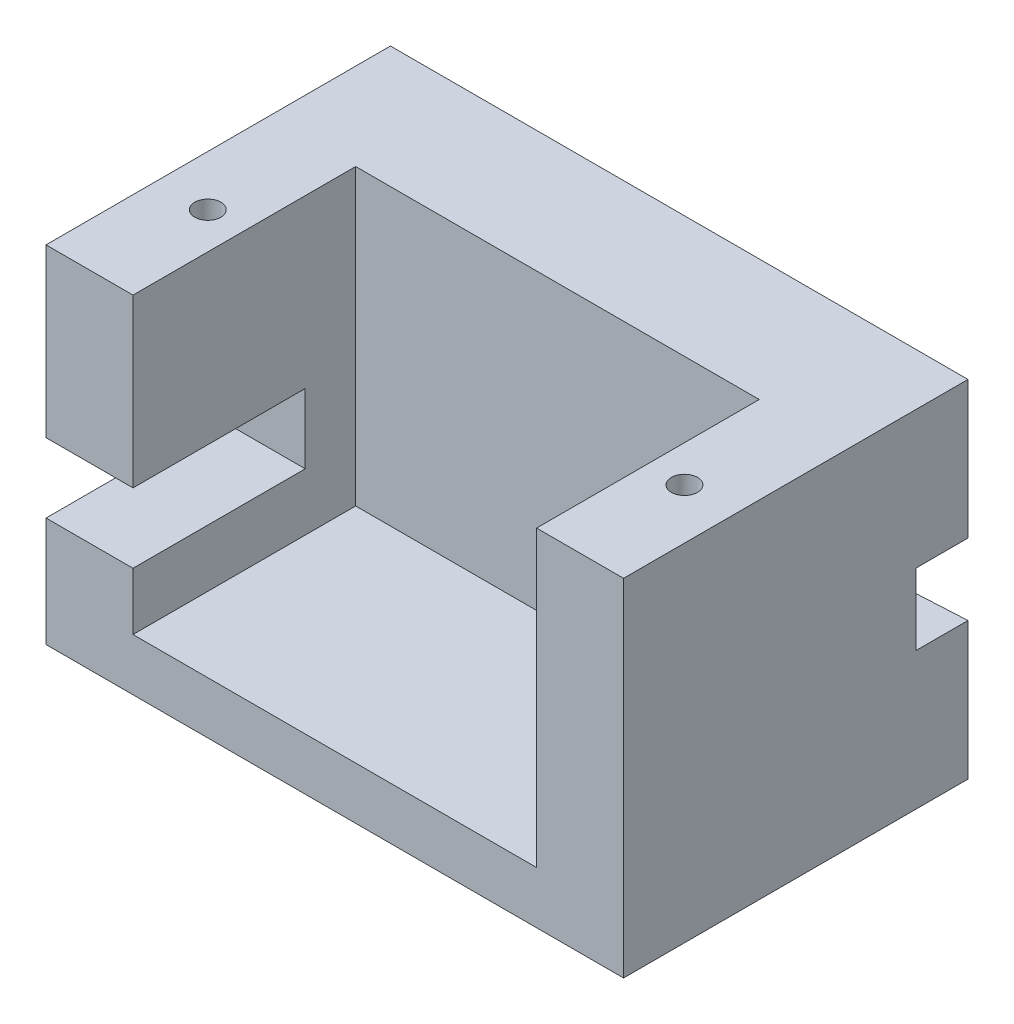
ISO-10303-21;
HEADER;
FILE_DESCRIPTION(('STEP AP214'),'2;1');
FILE_NAME('part.step','',(''),(''),'','','');
FILE_SCHEMA(('AUTOMOTIVE_DESIGN { 1 0 10303 214 1 1 1 1 }'));
ENDSEC;
DATA;
#1=APPLICATION_CONTEXT('core data for automotive mechanical design processes');
#2=APPLICATION_PROTOCOL_DEFINITION('international standard','automotive_design',2000,#1);
#3=PRODUCT_CONTEXT('',#1,'mechanical');
#4=PRODUCT('Part','Part','',(#3));
#5=PRODUCT_RELATED_PRODUCT_CATEGORY('part','',(#4));
#6=PRODUCT_DEFINITION_FORMATION('','',#4);
#7=PRODUCT_DEFINITION_CONTEXT('part definition',#1,'design');
#8=PRODUCT_DEFINITION('design','',#6,#7);
#9=PRODUCT_DEFINITION_SHAPE('','',#8);
#10=(LENGTH_UNIT() NAMED_UNIT(*) SI_UNIT(.MILLI.,.METRE.));
#11=(NAMED_UNIT(*) PLANE_ANGLE_UNIT() SI_UNIT($,.RADIAN.));
#12=(NAMED_UNIT(*) SI_UNIT($,.STERADIAN.) SOLID_ANGLE_UNIT());
#13=UNCERTAINTY_MEASURE_WITH_UNIT(LENGTH_MEASURE(1.E-05),#10,'distance_accuracy_value','');
#14=(GEOMETRIC_REPRESENTATION_CONTEXT(3) GLOBAL_UNCERTAINTY_ASSIGNED_CONTEXT((#13)) GLOBAL_UNIT_ASSIGNED_CONTEXT((#10,
#11,#12)) REPRESENTATION_CONTEXT('',''));
#15=CARTESIAN_POINT('',(0.,0.,0.));
#16=DIRECTION('',(0.,0.,1.));
#17=DIRECTION('',(1.,0.,0.));
#18=AXIS2_PLACEMENT_3D('',#15,#16,#17);
#19=CARTESIAN_POINT('',(27.9,16.6,0.3));
#20=DIRECTION('',(0.,0.,-1.));
#21=DIRECTION('',(0.,1.,0.));
#22=AXIS2_PLACEMENT_3D('',#19,#20,#21);
#23=PLANE('',#22);
#24=DIRECTION('',(0.,-1.,0.));
#25=VECTOR('',#24,1.);
#26=CARTESIAN_POINT('',(-0.3,57.175054314054,0.3));
#27=LINE('',#26,#25);
#28=CARTESIAN_POINT('',(-0.300000000000002,3.,0.3));
#29=VERTEX_POINT('',#28);
#30=CARTESIAN_POINT('',(-0.3,-0.3,0.300000000000004));
#31=VERTEX_POINT('',#30);
#32=EDGE_CURVE('E184',#29,#31,#27,.T.);
#33=ORIENTED_EDGE('',*,*,#32,.F.);
#34=DIRECTION('',(-1.,0.,0.));
#35=VECTOR('',#34,1.);
#36=CARTESIAN_POINT('',(27.901,3.,0.299999999999999));
#37=LINE('',#36,#35);
#38=CARTESIAN_POINT('',(-5.3,3.,0.300000000000004));
#39=VERTEX_POINT('',#38);
#40=EDGE_CURVE('E192',#29,#39,#37,.T.);
#41=ORIENTED_EDGE('',*,*,#40,.T.);
#42=DIRECTION('',(0.,-1.,0.));
#43=VECTOR('',#42,1.);
#44=CARTESIAN_POINT('',(-5.3,16.6,0.300000000000001));
#45=LINE('',#44,#43);
#46=CARTESIAN_POINT('',(-5.3,-3.3,0.300000000000001));
#47=VERTEX_POINT('',#46);
#48=EDGE_CURVE('E424',#39,#47,#45,.T.);
#49=ORIENTED_EDGE('',*,*,#48,.T.);
#50=DIRECTION('',(-1.,0.,0.));
#51=VECTOR('',#50,1.);
#52=CARTESIAN_POINT('',(27.9,-3.3,0.300000000000005));
#53=LINE('',#52,#51);
#54=CARTESIAN_POINT('',(27.9,-3.3,0.300000000000005));
#55=VERTEX_POINT('',#54);
#56=EDGE_CURVE('E313',#55,#47,#53,.T.);
#57=ORIENTED_EDGE('',*,*,#56,.F.);
#58=DIRECTION('',(0.,-1.,0.));
#59=VECTOR('',#58,1.);
#60=CARTESIAN_POINT('',(27.9,16.6,0.3));
#61=LINE('',#60,#59);
#62=CARTESIAN_POINT('',(27.9,16.6,0.3));
#63=VERTEX_POINT('',#62);
#64=EDGE_CURVE('E419',#63,#55,#61,.T.);
#65=ORIENTED_EDGE('',*,*,#64,.F.);
#66=DIRECTION('',(-1.,0.,0.));
#67=VECTOR('',#66,1.);
#68=CARTESIAN_POINT('',(27.9,16.6,0.3));
#69=LINE('',#68,#67);
#70=CARTESIAN_POINT('',(22.9,16.6,0.3));
#71=VERTEX_POINT('',#70);
#72=EDGE_CURVE('E413',#63,#71,#69,.T.);
#73=ORIENTED_EDGE('',*,*,#72,.T.);
#74=DIRECTION('',(0.,-1.,0.));
#75=VECTOR('',#74,1.);
#76=CARTESIAN_POINT('',(22.9,57.175054314054,0.3));
#77=LINE('',#76,#75);
#78=CARTESIAN_POINT('',(22.9,-0.3,0.300000000000004));
#79=VERTEX_POINT('',#78);
#80=EDGE_CURVE('E215',#71,#79,#77,.T.);
#81=ORIENTED_EDGE('',*,*,#80,.T.);
#82=DIRECTION('',(-1.,0.,0.));
#83=VECTOR('',#82,1.);
#84=CARTESIAN_POINT('',(22.9,-0.3,0.3));
#85=LINE('',#84,#83);
#86=EDGE_CURVE('E200',#79,#31,#85,.T.);
#87=ORIENTED_EDGE('',*,*,#86,.T.);
#88=EDGE_LOOP('',(#33,#41,#49,#57,#65,#73,#81,#87));
#89=FACE_BOUND('',#88,.T.);
#90=ADVANCED_FACE('F39',(#89),#23,.F.);
#91=CARTESIAN_POINT('',(0.,0.,-19.5));
#92=DIRECTION('',(0.,0.,-1.));
#93=DIRECTION('',(-1.,0.,0.));
#94=AXIS2_PLACEMENT_3D('',#91,#92,#93);
#95=PLANE('',#94);
#96=DIRECTION('',(-0.998711997828753,0.0507380073800736,0.));
#97=VECTOR('',#96,1.);
#98=CARTESIAN_POINT('',(-1.89708740221759,4.425,-19.5));
#99=LINE('',#98,#97);
#100=CARTESIAN_POINT('',(8.9289506542461,3.875,-19.5));
#101=VERTEX_POINT('',#100);
#102=CARTESIAN_POINT('',(-5.29999999999999,4.59787967389537,-19.5));
#103=VERTEX_POINT('',#102);
#104=EDGE_CURVE('E354',#101,#103,#99,.T.);
#105=ORIENTED_EDGE('',*,*,#104,.F.);
#106=CARTESIAN_POINT('',(11.3,6.65,-19.5));
#107=DIRECTION('',(0.,0.,-1.));
#108=DIRECTION('',(-1.,0.,0.));
#109=AXIS2_PLACEMENT_3D('',#106,#107,#108);
#110=CIRCLE('',#109,3.65);
#111=CARTESIAN_POINT('',(13.6710493457539,3.875,-19.5));
#112=VERTEX_POINT('',#111);
#113=EDGE_CURVE('E357',#112,#101,#110,.T.);
#114=ORIENTED_EDGE('',*,*,#113,.F.);
#115=DIRECTION('',(-0.998711997828753,-0.050738007380074,0.));
#116=VECTOR('',#115,1.);
#117=CARTESIAN_POINT('',(13.6710493457539,3.875,-19.5));
#118=LINE('',#117,#116);
#119=CARTESIAN_POINT('',(27.9,4.59787967389538,-19.5));
#120=VERTEX_POINT('',#119);
#121=EDGE_CURVE('E361',#120,#112,#118,.T.);
#122=ORIENTED_EDGE('',*,*,#121,.F.);
#123=DIRECTION('',(0.,-1.,0.));
#124=VECTOR('',#123,1.);
#125=CARTESIAN_POINT('',(27.9,16.6,-19.5));
#126=LINE('',#125,#124);
#127=CARTESIAN_POINT('',(27.9,-3.3,-19.5));
#128=VERTEX_POINT('',#127);
#129=EDGE_CURVE('E273',#120,#128,#126,.T.);
#130=ORIENTED_EDGE('',*,*,#129,.T.);
#131=DIRECTION('',(-1.,0.,0.));
#132=VECTOR('',#131,1.);
#133=CARTESIAN_POINT('',(27.9,-3.3,-19.5));
#134=LINE('',#133,#132);
#135=CARTESIAN_POINT('',(-5.3,-3.3,-19.5));
#136=VERTEX_POINT('',#135);
#137=EDGE_CURVE('E268',#128,#136,#134,.T.);
#138=ORIENTED_EDGE('',*,*,#137,.T.);
#139=DIRECTION('',(0.,1.,0.));
#140=VECTOR('',#139,1.);
#141=CARTESIAN_POINT('',(-5.3,-3.3,-19.5));
#142=LINE('',#141,#140);
#143=EDGE_CURVE('E267',#136,#103,#142,.T.);
#144=ORIENTED_EDGE('',*,*,#143,.T.);
#145=EDGE_LOOP('',(#105,#114,#122,#130,#138,#144));
#146=FACE_BOUND('',#145,.T.);
#147=ADVANCED_FACE('F320',(#146),#95,.T.);
#148=CARTESIAN_POINT('',(27.9,57.175054314054,-17.5));
#149=DIRECTION('',(1.,0.,0.));
#150=DIRECTION('',(0.,0.,-1.));
#151=AXIS2_PLACEMENT_3D('',#148,#149,#150);
#152=PLANE('',#151);
#153=ORIENTED_EDGE('',*,*,#64,.T.);
#154=DIRECTION('',(0.,0.,1.));
#155=VECTOR('',#154,1.);
#156=CARTESIAN_POINT('',(27.9,-3.3,-17.5));
#157=LINE('',#156,#155);
#158=EDGE_CURVE('E301',#128,#55,#157,.T.);
#159=ORIENTED_EDGE('',*,*,#158,.F.);
#160=ORIENTED_EDGE('',*,*,#129,.F.);
#161=DIRECTION('',(0.,0.,-1.));
#162=VECTOR('',#161,1.);
#163=CARTESIAN_POINT('',(27.9,4.59787967389538,-16.5));
#164=LINE('',#163,#162);
#165=CARTESIAN_POINT('',(27.9,4.59787967389538,-16.5));
#166=VERTEX_POINT('',#165);
#167=EDGE_CURVE('E338',#166,#120,#164,.T.);
#168=ORIENTED_EDGE('',*,*,#167,.F.);
#169=DIRECTION('',(0.,-1.,0.));
#170=VECTOR('',#169,1.);
#171=CARTESIAN_POINT('',(27.9,8.70212032610463,-16.5));
#172=LINE('',#171,#170);
#173=CARTESIAN_POINT('',(27.9,8.70212032610463,-16.5));
#174=VERTEX_POINT('',#173);
#175=EDGE_CURVE('E388',#174,#166,#172,.T.);
#176=ORIENTED_EDGE('',*,*,#175,.F.);
#177=DIRECTION('',(0.,0.,-1.));
#178=VECTOR('',#177,1.);
#179=CARTESIAN_POINT('',(27.9,8.70212032610463,-16.5));
#180=LINE('',#179,#178);
#181=CARTESIAN_POINT('',(27.9,8.70212032610463,-19.5));
#182=VERTEX_POINT('',#181);
#183=EDGE_CURVE('E333',#174,#182,#180,.T.);
#184=ORIENTED_EDGE('',*,*,#183,.T.);
#185=CARTESIAN_POINT('',(27.9,16.6,-19.5));
#186=VERTEX_POINT('',#185);
#187=EDGE_CURVE('E190',#186,#182,#126,.T.);
#188=ORIENTED_EDGE('',*,*,#187,.F.);
#189=DIRECTION('',(0.,0.,1.));
#190=VECTOR('',#189,1.);
#191=CARTESIAN_POINT('',(27.9,16.6,-17.5));
#192=LINE('',#191,#190);
#193=EDGE_CURVE('E239',#186,#63,#192,.T.);
#194=ORIENTED_EDGE('',*,*,#193,.T.);
#195=EDGE_LOOP('',(#153,#159,#160,#168,#176,#184,#188,#194));
#196=FACE_BOUND('',#195,.T.);
#197=ADVANCED_FACE('F446',(#196),#152,.T.);
#198=CARTESIAN_POINT('',(-5.3,57.175054314054,-17.5));
#199=DIRECTION('',(-1.,0.,0.));
#200=DIRECTION('',(0.,0.,1.));
#201=AXIS2_PLACEMENT_3D('',#198,#199,#200);
#202=PLANE('',#201);
#203=ORIENTED_EDGE('',*,*,#48,.F.);
#204=DIRECTION('',(0.,0.,1.));
#205=VECTOR('',#204,1.);
#206=CARTESIAN_POINT('',(-5.3,3.,-9.6));
#207=LINE('',#206,#205);
#208=CARTESIAN_POINT('',(-5.3,3.,-9.6));
#209=VERTEX_POINT('',#208);
#210=EDGE_CURVE('E57',#209,#39,#207,.T.);
#211=ORIENTED_EDGE('',*,*,#210,.F.);
#212=DIRECTION('',(0.,-1.,0.));
#213=VECTOR('',#212,1.);
#214=CARTESIAN_POINT('',(-5.3,7.,-9.6));
#215=LINE('',#214,#213);
#216=CARTESIAN_POINT('',(-5.3,7.,-9.6));
#217=VERTEX_POINT('',#216);
#218=EDGE_CURVE('E289',#217,#209,#215,.T.);
#219=ORIENTED_EDGE('',*,*,#218,.F.);
#220=DIRECTION('',(0.,0.,1.));
#221=VECTOR('',#220,1.);
#222=CARTESIAN_POINT('',(-5.3,7.,-9.6));
#223=LINE('',#222,#221);
#224=CARTESIAN_POINT('',(-5.3,7.,0.300000000000001));
#225=VERTEX_POINT('',#224);
#226=EDGE_CURVE('E282',#217,#225,#223,.T.);
#227=ORIENTED_EDGE('',*,*,#226,.T.);
#228=CARTESIAN_POINT('',(-5.3,16.6,0.300000000000001));
#229=VERTEX_POINT('',#228);
#230=EDGE_CURVE('E252',#229,#225,#45,.T.);
#231=ORIENTED_EDGE('',*,*,#230,.F.);
#232=DIRECTION('',(0.,0.,-1.));
#233=VECTOR('',#232,1.);
#234=CARTESIAN_POINT('',(-5.3,16.6,-17.5));
#235=LINE('',#234,#233);
#236=CARTESIAN_POINT('',(-5.3,16.6,-19.5));
#237=VERTEX_POINT('',#236);
#238=EDGE_CURVE('E217',#229,#237,#235,.T.);
#239=ORIENTED_EDGE('',*,*,#238,.T.);
#240=CARTESIAN_POINT('',(-5.29999999999999,8.70212032610463,-19.5));
#241=VERTEX_POINT('',#240);
#242=EDGE_CURVE('E250',#241,#237,#142,.T.);
#243=ORIENTED_EDGE('',*,*,#242,.F.);
#244=DIRECTION('',(0.,0.,-1.));
#245=VECTOR('',#244,1.);
#246=CARTESIAN_POINT('',(-5.29999999999999,8.70212032610463,-16.5));
#247=LINE('',#246,#245);
#248=CARTESIAN_POINT('',(-5.29999999999999,8.70212032610463,-16.5));
#249=VERTEX_POINT('',#248);
#250=EDGE_CURVE('E326',#249,#241,#247,.T.);
#251=ORIENTED_EDGE('',*,*,#250,.F.);
#252=DIRECTION('',(0.,1.,0.));
#253=VECTOR('',#252,1.);
#254=CARTESIAN_POINT('',(-5.29999999999999,8.70212032610463,-16.5));
#255=LINE('',#254,#253);
#256=CARTESIAN_POINT('',(-5.29999999999999,4.59787967389537,-16.5));
#257=VERTEX_POINT('',#256);
#258=EDGE_CURVE('E374',#257,#249,#255,.T.);
#259=ORIENTED_EDGE('',*,*,#258,.F.);
#260=DIRECTION('',(0.,0.,-1.));
#261=VECTOR('',#260,1.);
#262=CARTESIAN_POINT('',(-5.29999999999999,4.59787967389537,-16.5));
#263=LINE('',#262,#261);
#264=EDGE_CURVE('E317',#257,#103,#263,.T.);
#265=ORIENTED_EDGE('',*,*,#264,.T.);
#266=ORIENTED_EDGE('',*,*,#143,.F.);
#267=DIRECTION('',(0.,0.,-1.));
#268=VECTOR('',#267,1.);
#269=CARTESIAN_POINT('',(-5.3,-3.3,5.3));
#270=LINE('',#269,#268);
#271=EDGE_CURVE('E230',#47,#136,#270,.T.);
#272=ORIENTED_EDGE('',*,*,#271,.F.);
#273=EDGE_LOOP('',(#203,#211,#219,#227,#231,#239,#243,#251,#259,#265,#266,#272));
#274=FACE_BOUND('',#273,.T.);
#275=ADVANCED_FACE('F248',(#274),#202,.T.);
#276=CARTESIAN_POINT('',(22.9,57.175054314054,-12.5));
#277=DIRECTION('',(1.,0.,0.));
#278=DIRECTION('',(0.,0.,-1.));
#279=AXIS2_PLACEMENT_3D('',#276,#277,#278);
#280=PLANE('',#279);
#281=DIRECTION('',(0.,0.,1.));
#282=VECTOR('',#281,1.);
#283=CARTESIAN_POINT('',(22.9,16.6,-12.5));
#284=LINE('',#283,#282);
#285=CARTESIAN_POINT('',(22.9,16.6,-12.5));
#286=VERTEX_POINT('',#285);
#287=EDGE_CURVE('E235',#286,#71,#284,.T.);
#288=ORIENTED_EDGE('',*,*,#287,.F.);
#289=DIRECTION('',(0.,-1.,0.));
#290=VECTOR('',#289,1.);
#291=CARTESIAN_POINT('',(22.9,57.175054314054,-12.5));
#292=LINE('',#291,#290);
#293=CARTESIAN_POINT('',(22.9,-0.3,-12.5));
#294=VERTEX_POINT('',#293);
#295=EDGE_CURVE('E218',#286,#294,#292,.T.);
#296=ORIENTED_EDGE('',*,*,#295,.T.);
#297=DIRECTION('',(0.,0.,1.));
#298=VECTOR('',#297,1.);
#299=CARTESIAN_POINT('',(22.9,-0.3,-12.5));
#300=LINE('',#299,#298);
#301=EDGE_CURVE('E221',#294,#79,#300,.T.);
#302=ORIENTED_EDGE('',*,*,#301,.T.);
#303=ORIENTED_EDGE('',*,*,#80,.F.);
#304=EDGE_LOOP('',(#288,#296,#302,#303));
#305=FACE_BOUND('',#304,.T.);
#306=ADVANCED_FACE('F467',(#305),#280,.F.);
#307=CARTESIAN_POINT('',(22.9,57.175054314054,-12.5));
#308=DIRECTION('',(0.,0.,-1.));
#309=DIRECTION('',(-1.,0.,0.));
#310=AXIS2_PLACEMENT_3D('',#307,#308,#309);
#311=PLANE('',#310);
#312=DIRECTION('',(1.,0.,0.));
#313=VECTOR('',#312,1.);
#314=CARTESIAN_POINT('',(22.9,16.6,-12.5));
#315=LINE('',#314,#313);
#316=CARTESIAN_POINT('',(-0.3,16.6,-12.5));
#317=VERTEX_POINT('',#316);
#318=EDGE_CURVE('E11',#317,#286,#315,.T.);
#319=ORIENTED_EDGE('',*,*,#318,.F.);
#320=DIRECTION('',(0.,-1.,0.));
#321=VECTOR('',#320,1.);
#322=CARTESIAN_POINT('',(-0.3,57.175054314054,-12.5));
#323=LINE('',#322,#321);
#324=CARTESIAN_POINT('',(-0.3,-0.3,-12.5));
#325=VERTEX_POINT('',#324);
#326=EDGE_CURVE('E43',#317,#325,#323,.T.);
#327=ORIENTED_EDGE('',*,*,#326,.T.);
#328=DIRECTION('',(1.,0.,0.));
#329=VECTOR('',#328,1.);
#330=CARTESIAN_POINT('',(22.9,-0.3,-12.5));
#331=LINE('',#330,#329);
#332=EDGE_CURVE('E204',#325,#294,#331,.T.);
#333=ORIENTED_EDGE('',*,*,#332,.T.);
#334=ORIENTED_EDGE('',*,*,#295,.F.);
#335=EDGE_LOOP('',(#319,#327,#333,#334));
#336=FACE_BOUND('',#335,.T.);
#337=ADVANCED_FACE('F465',(#336),#311,.F.);
#338=CARTESIAN_POINT('',(-0.3,57.175054314054,-12.5));
#339=DIRECTION('',(-1.,0.,0.));
#340=DIRECTION('',(0.,0.,1.));
#341=AXIS2_PLACEMENT_3D('',#338,#339,#340);
#342=PLANE('',#341);
#343=DIRECTION('',(0.,0.,-1.));
#344=VECTOR('',#343,1.);
#345=CARTESIAN_POINT('',(-0.300000000000002,3.,-9.6));
#346=LINE('',#345,#344);
#347=CARTESIAN_POINT('',(-0.3,3.,-9.6));
#348=VERTEX_POINT('',#347);
#349=EDGE_CURVE('E180',#29,#348,#346,.T.);
#350=ORIENTED_EDGE('',*,*,#349,.F.);
#351=ORIENTED_EDGE('',*,*,#32,.T.);
#352=DIRECTION('',(0.,0.,-1.));
#353=VECTOR('',#352,1.);
#354=CARTESIAN_POINT('',(-0.3,-0.3,-12.5));
#355=LINE('',#354,#353);
#356=EDGE_CURVE('E209',#31,#325,#355,.T.);
#357=ORIENTED_EDGE('',*,*,#356,.T.);
#358=ORIENTED_EDGE('',*,*,#326,.F.);
#359=DIRECTION('',(0.,0.,-1.));
#360=VECTOR('',#359,1.);
#361=CARTESIAN_POINT('',(-0.3,16.6,-12.5));
#362=LINE('',#361,#360);
#363=CARTESIAN_POINT('',(-0.299999999999995,16.6,0.3));
#364=VERTEX_POINT('',#363);
#365=EDGE_CURVE('E49',#364,#317,#362,.T.);
#366=ORIENTED_EDGE('',*,*,#365,.F.);
#367=CARTESIAN_POINT('',(-0.3,7.00000000000001,0.3));
#368=VERTEX_POINT('',#367);
#369=EDGE_CURVE('E203',#364,#368,#27,.T.);
#370=ORIENTED_EDGE('',*,*,#369,.T.);
#371=DIRECTION('',(0.,0.,-1.));
#372=VECTOR('',#371,1.);
#373=CARTESIAN_POINT('',(-0.300000000000002,7.,-9.6));
#374=LINE('',#373,#372);
#375=CARTESIAN_POINT('',(-0.300000000000002,7.,-9.6));
#376=VERTEX_POINT('',#375);
#377=EDGE_CURVE('E65',#368,#376,#374,.T.);
#378=ORIENTED_EDGE('',*,*,#377,.T.);
#379=DIRECTION('',(0.,1.,0.));
#380=VECTOR('',#379,1.);
#381=CARTESIAN_POINT('',(-0.300000000000002,7.,-9.6));
#382=LINE('',#381,#380);
#383=EDGE_CURVE('E187',#348,#376,#382,.T.);
#384=ORIENTED_EDGE('',*,*,#383,.F.);
#385=EDGE_LOOP('',(#350,#351,#357,#358,#366,#370,#378,#384));
#386=FACE_BOUND('',#385,.T.);
#387=ADVANCED_FACE('F181',(#386),#342,.F.);
#388=CARTESIAN_POINT('',(0.,16.6,0.));
#389=DIRECTION('',(0.,1.,0.));
#390=DIRECTION('',(0.,0.,1.));
#391=AXIS2_PLACEMENT_3D('',#388,#389,#390);
#392=PLANE('',#391);
#393=ORIENTED_EDGE('',*,*,#72,.F.);
#394=ORIENTED_EDGE('',*,*,#193,.F.);
#395=DIRECTION('',(1.,0.,0.));
#396=VECTOR('',#395,1.);
#397=CARTESIAN_POINT('',(-5.3,16.6,-19.5));
#398=LINE('',#397,#396);
#399=EDGE_CURVE('E261',#237,#186,#398,.T.);
#400=ORIENTED_EDGE('',*,*,#399,.F.);
#401=ORIENTED_EDGE('',*,*,#238,.F.);
#402=EDGE_CURVE('E416',#364,#229,#69,.T.);
#403=ORIENTED_EDGE('',*,*,#402,.F.);
#404=ORIENTED_EDGE('',*,*,#365,.T.);
#405=ORIENTED_EDGE('',*,*,#318,.T.);
#406=ORIENTED_EDGE('',*,*,#287,.T.);
#407=EDGE_LOOP('',(#393,#394,#400,#401,#403,#404,#405,#406));
#408=FACE_BOUND('',#407,.T.);
#409=CARTESIAN_POINT('',(-2.4,16.6,-6.1));
#410=DIRECTION('',(0.,1.,0.));
#411=DIRECTION('',(0.,0.,1.));
#412=AXIS2_PLACEMENT_3D('',#409,#410,#411);
#413=CIRCLE('',#412,0.75);
#414=CARTESIAN_POINT('',(-2.4,16.6,-5.35));
#415=VERTEX_POINT('',#414);
#416=EDGE_CURVE('E406',#415,#415,#413,.T.);
#417=ORIENTED_EDGE('',*,*,#416,.F.);
#418=EDGE_LOOP('',(#417));
#419=FACE_BOUND('',#418,.T.);
#420=CARTESIAN_POINT('',(25.,16.6,-6.1));
#421=DIRECTION('',(0.,1.,0.));
#422=DIRECTION('',(0.,0.,1.));
#423=AXIS2_PLACEMENT_3D('',#420,#421,#422);
#424=CIRCLE('',#423,0.750000000000002);
#425=CARTESIAN_POINT('',(25.,16.6,-5.35));
#426=VERTEX_POINT('',#425);
#427=EDGE_CURVE('E398',#426,#426,#424,.T.);
#428=ORIENTED_EDGE('',*,*,#427,.F.);
#429=EDGE_LOOP('',(#428));
#430=FACE_BOUND('',#429,.T.);
#431=ADVANCED_FACE('F41',(#408,#419,#430),#392,.T.);
#432=CARTESIAN_POINT('',(0.,-0.3,0.));
#433=DIRECTION('',(0.,-1.,0.));
#434=DIRECTION('',(0.,0.,-1.));
#435=AXIS2_PLACEMENT_3D('',#432,#433,#434);
#436=PLANE('',#435);
#437=ORIENTED_EDGE('',*,*,#86,.F.);
#438=ORIENTED_EDGE('',*,*,#301,.F.);
#439=ORIENTED_EDGE('',*,*,#332,.F.);
#440=ORIENTED_EDGE('',*,*,#356,.F.);
#441=EDGE_LOOP('',(#437,#438,#439,#440));
#442=FACE_BOUND('',#441,.T.);
#443=ADVANCED_FACE('F469',(#442),#436,.F.);
#444=CARTESIAN_POINT('',(0.,-3.3,0.));
#445=DIRECTION('',(0.,-1.,0.));
#446=DIRECTION('',(0.,0.,-1.));
#447=AXIS2_PLACEMENT_3D('',#444,#445,#446);
#448=PLANE('',#447);
#449=ORIENTED_EDGE('',*,*,#56,.T.);
#450=ORIENTED_EDGE('',*,*,#271,.T.);
#451=ORIENTED_EDGE('',*,*,#137,.F.);
#452=ORIENTED_EDGE('',*,*,#158,.T.);
#453=EDGE_LOOP('',(#449,#450,#451,#452));
#454=FACE_BOUND('',#453,.T.);
#455=ADVANCED_FACE('F311',(#454),#448,.T.);
#456=CARTESIAN_POINT('',(27.901,3.,-9.6));
#457=DIRECTION('',(0.,-1.,0.));
#458=DIRECTION('',(0.,0.,-1.));
#459=AXIS2_PLACEMENT_3D('',#456,#457,#458);
#460=PLANE('',#459);
#461=ORIENTED_EDGE('',*,*,#349,.T.);
#462=DIRECTION('',(-1.,0.,0.));
#463=VECTOR('',#462,1.);
#464=CARTESIAN_POINT('',(27.901,3.,-9.6));
#465=LINE('',#464,#463);
#466=EDGE_CURVE('E285',#348,#209,#465,.T.);
#467=ORIENTED_EDGE('',*,*,#466,.T.);
#468=ORIENTED_EDGE('',*,*,#210,.T.);
#469=ORIENTED_EDGE('',*,*,#40,.F.);
#470=EDGE_LOOP('',(#461,#467,#468,#469));
#471=FACE_BOUND('',#470,.T.);
#472=ADVANCED_FACE('F193',(#471),#460,.F.);
#473=CARTESIAN_POINT('',(27.901,7.,-9.6));
#474=DIRECTION('',(0.,-1.,0.));
#475=DIRECTION('',(0.,0.,-1.));
#476=AXIS2_PLACEMENT_3D('',#473,#474,#475);
#477=PLANE('',#476);
#478=ORIENTED_EDGE('',*,*,#377,.F.);
#479=DIRECTION('',(-1.,0.,0.));
#480=VECTOR('',#479,1.);
#481=CARTESIAN_POINT('',(27.901,7.,0.299999999999999));
#482=LINE('',#481,#480);
#483=EDGE_CURVE('E197',#368,#225,#482,.T.);
#484=ORIENTED_EDGE('',*,*,#483,.T.);
#485=ORIENTED_EDGE('',*,*,#226,.F.);
#486=DIRECTION('',(-1.,0.,0.));
#487=VECTOR('',#486,1.);
#488=CARTESIAN_POINT('',(27.901,7.,-9.6));
#489=LINE('',#488,#487);
#490=EDGE_CURVE('E286',#376,#217,#489,.T.);
#491=ORIENTED_EDGE('',*,*,#490,.F.);
#492=EDGE_LOOP('',(#478,#484,#485,#491));
#493=FACE_BOUND('',#492,.T.);
#494=ADVANCED_FACE('F431',(#493),#477,.T.);
#495=CARTESIAN_POINT('',(27.901,7.,-9.6));
#496=DIRECTION('',(0.,0.,-1.));
#497=DIRECTION('',(-1.,0.,0.));
#498=AXIS2_PLACEMENT_3D('',#495,#496,#497);
#499=PLANE('',#498);
#500=ORIENTED_EDGE('',*,*,#383,.T.);
#501=ORIENTED_EDGE('',*,*,#490,.T.);
#502=ORIENTED_EDGE('',*,*,#218,.T.);
#503=ORIENTED_EDGE('',*,*,#466,.F.);
#504=EDGE_LOOP('',(#500,#501,#502,#503));
#505=FACE_BOUND('',#504,.T.);
#506=ADVANCED_FACE('F430',(#505),#499,.F.);
#507=DIRECTION('',(0.998711997828753,0.0507380073800737,0.));
#508=VECTOR('',#507,1.);
#509=CARTESIAN_POINT('',(8.9289506542461,9.425,-19.5));
#510=LINE('',#509,#508);
#511=CARTESIAN_POINT('',(8.9289506542461,9.425,-19.5));
#512=VERTEX_POINT('',#511);
#513=EDGE_CURVE('E265',#241,#512,#510,.T.);
#514=ORIENTED_EDGE('',*,*,#513,.F.);
#515=ORIENTED_EDGE('',*,*,#242,.T.);
#516=ORIENTED_EDGE('',*,*,#399,.T.);
#517=ORIENTED_EDGE('',*,*,#187,.T.);
#518=DIRECTION('',(0.998711997828753,-0.0507380073800736,0.));
#519=VECTOR('',#518,1.);
#520=CARTESIAN_POINT('',(24.4970874022176,8.875,-19.5));
#521=LINE('',#520,#519);
#522=CARTESIAN_POINT('',(13.6710493457539,9.425,-19.5));
#523=VERTEX_POINT('',#522);
#524=EDGE_CURVE('E365',#523,#182,#521,.T.);
#525=ORIENTED_EDGE('',*,*,#524,.F.);
#526=CARTESIAN_POINT('',(11.3,6.65,-19.5));
#527=DIRECTION('',(0.,0.,-1.));
#528=DIRECTION('',(-1.,0.,0.));
#529=AXIS2_PLACEMENT_3D('',#526,#527,#528);
#530=CIRCLE('',#529,3.65);
#531=EDGE_CURVE('E368',#512,#523,#530,.T.);
#532=ORIENTED_EDGE('',*,*,#531,.F.);
#533=EDGE_LOOP('',(#514,#515,#516,#517,#525,#532));
#534=FACE_BOUND('',#533,.T.);
#535=ADVANCED_FACE('F259',(#534),#95,.T.);
#536=CARTESIAN_POINT('',(11.3,6.65,-16.5));
#537=DIRECTION('',(0.,0.,-1.));
#538=DIRECTION('',(-1.,0.,0.));
#539=AXIS2_PLACEMENT_3D('',#536,#537,#538);
#540=CYLINDRICAL_SURFACE('',#539,3.65);
#541=ORIENTED_EDGE('',*,*,#531,.T.);
#542=DIRECTION('',(0.,0.,-1.));
#543=VECTOR('',#542,1.);
#544=CARTESIAN_POINT('',(13.6710493457539,9.425,-16.5));
#545=LINE('',#544,#543);
#546=CARTESIAN_POINT('',(13.6710493457539,9.425,-16.5));
#547=VERTEX_POINT('',#546);
#548=EDGE_CURVE('E329',#547,#523,#545,.T.);
#549=ORIENTED_EDGE('',*,*,#548,.F.);
#550=CARTESIAN_POINT('',(11.3,6.65,-16.5));
#551=DIRECTION('',(0.,0.,-1.));
#552=DIRECTION('',(-1.,0.,0.));
#553=AXIS2_PLACEMENT_3D('',#550,#551,#552);
#554=CIRCLE('',#553,3.65);
#555=CARTESIAN_POINT('',(8.9289506542461,9.425,-16.5));
#556=VERTEX_POINT('',#555);
#557=EDGE_CURVE('E353',#556,#547,#554,.T.);
#558=ORIENTED_EDGE('',*,*,#557,.F.);
#559=DIRECTION('',(0.,0.,-1.));
#560=VECTOR('',#559,1.);
#561=CARTESIAN_POINT('',(8.9289506542461,9.425,-16.5));
#562=LINE('',#561,#560);
#563=EDGE_CURVE('E324',#556,#512,#562,.T.);
#564=ORIENTED_EDGE('',*,*,#563,.T.);
#565=EDGE_LOOP('',(#541,#549,#558,#564));
#566=FACE_BOUND('',#565,.T.);
#567=ADVANCED_FACE('F556',(#566),#540,.F.);
#568=CARTESIAN_POINT('',(8.9289506542461,9.425,-16.5));
#569=DIRECTION('',(-0.0507380073800736,0.998711997828753,0.));
#570=DIRECTION('',(-0.998711997828753,-0.0507380073800737,0.));
#571=AXIS2_PLACEMENT_3D('',#568,#569,#570);
#572=PLANE('',#571);
#573=ORIENTED_EDGE('',*,*,#513,.T.);
#574=ORIENTED_EDGE('',*,*,#563,.F.);
#575=DIRECTION('',(0.998711997828753,0.0507380073800736,0.));
#576=VECTOR('',#575,1.);
#577=CARTESIAN_POINT('',(-1.89708740221759,8.875,-16.5));
#578=LINE('',#577,#576);
#579=EDGE_CURVE('E334',#249,#556,#578,.T.);
#580=ORIENTED_EDGE('',*,*,#579,.F.);
#581=ORIENTED_EDGE('',*,*,#250,.T.);
#582=EDGE_LOOP('',(#573,#574,#580,#581));
#583=FACE_BOUND('',#582,.T.);
#584=ADVANCED_FACE('F564',(#583),#572,.F.);
#585=CARTESIAN_POINT('',(-1.89708740221759,4.425,-16.5));
#586=DIRECTION('',(-0.0507380073800736,-0.998711997828753,0.));
#587=DIRECTION('',(0.998711997828753,-0.0507380073800736,0.));
#588=AXIS2_PLACEMENT_3D('',#585,#586,#587);
#589=PLANE('',#588);
#590=ORIENTED_EDGE('',*,*,#104,.T.);
#591=ORIENTED_EDGE('',*,*,#264,.F.);
#592=DIRECTION('',(-0.998711997828753,0.0507380073800737,0.));
#593=VECTOR('',#592,1.);
#594=CARTESIAN_POINT('',(8.9289506542461,3.875,-16.5));
#595=LINE('',#594,#593);
#596=CARTESIAN_POINT('',(8.9289506542461,3.875,-16.5));
#597=VERTEX_POINT('',#596);
#598=EDGE_CURVE('E378',#597,#257,#595,.T.);
#599=ORIENTED_EDGE('',*,*,#598,.F.);
#600=DIRECTION('',(0.,0.,-1.));
#601=VECTOR('',#600,1.);
#602=CARTESIAN_POINT('',(8.9289506542461,3.875,-16.5));
#603=LINE('',#602,#601);
#604=EDGE_CURVE('E344',#597,#101,#603,.T.);
#605=ORIENTED_EDGE('',*,*,#604,.T.);
#606=EDGE_LOOP('',(#590,#591,#599,#605));
#607=FACE_BOUND('',#606,.T.);
#608=ADVANCED_FACE('F574',(#607),#589,.F.);
#609=CARTESIAN_POINT('',(11.3,6.65,-16.5));
#610=DIRECTION('',(0.,0.,-1.));
#611=DIRECTION('',(-1.,0.,0.));
#612=AXIS2_PLACEMENT_3D('',#609,#610,#611);
#613=CYLINDRICAL_SURFACE('',#612,3.65);
#614=ORIENTED_EDGE('',*,*,#113,.T.);
#615=ORIENTED_EDGE('',*,*,#604,.F.);
#616=CARTESIAN_POINT('',(11.3,6.65,-16.5));
#617=DIRECTION('',(0.,0.,-1.));
#618=DIRECTION('',(-1.,0.,0.));
#619=AXIS2_PLACEMENT_3D('',#616,#617,#618);
#620=CIRCLE('',#619,3.65);
#621=CARTESIAN_POINT('',(13.6710493457539,3.875,-16.5));
#622=VERTEX_POINT('',#621);
#623=EDGE_CURVE('E381',#622,#597,#620,.T.);
#624=ORIENTED_EDGE('',*,*,#623,.F.);
#625=DIRECTION('',(0.,0.,-1.));
#626=VECTOR('',#625,1.);
#627=CARTESIAN_POINT('',(13.6710493457539,3.875,-16.5));
#628=LINE('',#627,#626);
#629=EDGE_CURVE('E341',#622,#112,#628,.T.);
#630=ORIENTED_EDGE('',*,*,#629,.T.);
#631=EDGE_LOOP('',(#614,#615,#624,#630));
#632=FACE_BOUND('',#631,.T.);
#633=ADVANCED_FACE('F587',(#632),#613,.F.);
#634=CARTESIAN_POINT('',(13.6710493457539,3.875,-16.5));
#635=DIRECTION('',(0.050738007380074,-0.998711997828753,0.));
#636=DIRECTION('',(0.998711997828753,0.050738007380074,0.));
#637=AXIS2_PLACEMENT_3D('',#634,#635,#636);
#638=PLANE('',#637);
#639=ORIENTED_EDGE('',*,*,#121,.T.);
#640=ORIENTED_EDGE('',*,*,#629,.F.);
#641=DIRECTION('',(-0.998711997828753,-0.0507380073800736,0.));
#642=VECTOR('',#641,1.);
#643=CARTESIAN_POINT('',(24.4970874022176,4.42500000000001,-16.5));
#644=LINE('',#643,#642);
#645=EDGE_CURVE('E385',#166,#622,#644,.T.);
#646=ORIENTED_EDGE('',*,*,#645,.F.);
#647=ORIENTED_EDGE('',*,*,#167,.T.);
#648=EDGE_LOOP('',(#639,#640,#646,#647));
#649=FACE_BOUND('',#648,.T.);
#650=ADVANCED_FACE('F600',(#649),#638,.F.);
#651=CARTESIAN_POINT('',(24.4970874022176,8.875,-16.5));
#652=DIRECTION('',(0.0507380073800736,0.998711997828753,0.));
#653=DIRECTION('',(-0.998711997828753,0.0507380073800736,0.));
#654=AXIS2_PLACEMENT_3D('',#651,#652,#653);
#655=PLANE('',#654);
#656=ORIENTED_EDGE('',*,*,#524,.T.);
#657=ORIENTED_EDGE('',*,*,#183,.F.);
#658=DIRECTION('',(0.998711997828753,-0.050738007380074,0.));
#659=VECTOR('',#658,1.);
#660=CARTESIAN_POINT('',(13.6710493457539,9.425,-16.5));
#661=LINE('',#660,#659);
#662=EDGE_CURVE('E392',#547,#174,#661,.T.);
#663=ORIENTED_EDGE('',*,*,#662,.F.);
#664=ORIENTED_EDGE('',*,*,#548,.T.);
#665=EDGE_LOOP('',(#656,#657,#663,#664));
#666=FACE_BOUND('',#665,.T.);
#667=ADVANCED_FACE('F610',(#666),#655,.F.);
#668=CARTESIAN_POINT('',(11.3,6.65,-16.5));
#669=DIRECTION('',(0.,0.,-1.));
#670=DIRECTION('',(-1.,0.,0.));
#671=AXIS2_PLACEMENT_3D('',#668,#669,#670);
#672=PLANE('',#671);
#673=ORIENTED_EDGE('',*,*,#557,.T.);
#674=ORIENTED_EDGE('',*,*,#662,.T.);
#675=ORIENTED_EDGE('',*,*,#175,.T.);
#676=ORIENTED_EDGE('',*,*,#645,.T.);
#677=ORIENTED_EDGE('',*,*,#623,.T.);
#678=ORIENTED_EDGE('',*,*,#598,.T.);
#679=ORIENTED_EDGE('',*,*,#258,.T.);
#680=ORIENTED_EDGE('',*,*,#579,.T.);
#681=EDGE_LOOP('',(#673,#674,#675,#676,#677,#678,#679,#680));
#682=FACE_BOUND('',#681,.T.);
#683=ADVANCED_FACE('F623',(#682),#672,.T.);
#684=CARTESIAN_POINT('',(25.,8.6,-6.1));
#685=DIRECTION('',(0.,1.,0.));
#686=DIRECTION('',(0.,0.,1.));
#687=AXIS2_PLACEMENT_3D('',#684,#685,#686);
#688=CYLINDRICAL_SURFACE('',#687,0.750000000000002);
#689=CARTESIAN_POINT('',(25.,8.6,-6.1));
#690=DIRECTION('',(0.,1.,0.));
#691=DIRECTION('',(0.,0.,1.));
#692=AXIS2_PLACEMENT_3D('',#689,#690,#691);
#693=CIRCLE('',#692,0.750000000000002);
#694=CARTESIAN_POINT('',(25.,8.6,-5.35));
#695=VERTEX_POINT('',#694);
#696=EDGE_CURVE('E402',#695,#695,#693,.T.);
#697=ORIENTED_EDGE('',*,*,#696,.F.);
#698=EDGE_LOOP('',(#697));
#699=FACE_BOUND('',#698,.T.);
#700=ORIENTED_EDGE('',*,*,#427,.T.);
#701=EDGE_LOOP('',(#700));
#702=FACE_BOUND('',#701,.T.);
#703=ADVANCED_FACE('F636',(#699,#702),#688,.F.);
#704=CARTESIAN_POINT('',(25.,8.6,-6.1));
#705=DIRECTION('',(0.,1.,0.));
#706=DIRECTION('',(0.,0.,1.));
#707=AXIS2_PLACEMENT_3D('',#704,#705,#706);
#708=PLANE('',#707);
#709=ORIENTED_EDGE('',*,*,#696,.T.);
#710=EDGE_LOOP('',(#709));
#711=FACE_BOUND('',#710,.T.);
#712=ADVANCED_FACE('F646',(#711),#708,.T.);
#713=CARTESIAN_POINT('',(-2.4,8.6,-6.1));
#714=DIRECTION('',(0.,1.,0.));
#715=DIRECTION('',(0.,0.,1.));
#716=AXIS2_PLACEMENT_3D('',#713,#714,#715);
#717=CYLINDRICAL_SURFACE('',#716,0.75);
#718=CARTESIAN_POINT('',(-2.4,8.6,-6.1));
#719=DIRECTION('',(0.,1.,0.));
#720=DIRECTION('',(0.,0.,1.));
#721=AXIS2_PLACEMENT_3D('',#718,#719,#720);
#722=CIRCLE('',#721,0.75);
#723=CARTESIAN_POINT('',(-2.4,8.6,-5.35));
#724=VERTEX_POINT('',#723);
#725=EDGE_CURVE('E371',#724,#724,#722,.T.);
#726=ORIENTED_EDGE('',*,*,#725,.F.);
#727=EDGE_LOOP('',(#726));
#728=FACE_BOUND('',#727,.T.);
#729=ORIENTED_EDGE('',*,*,#416,.T.);
#730=EDGE_LOOP('',(#729));
#731=FACE_BOUND('',#730,.T.);
#732=ADVANCED_FACE('F455',(#728,#731),#717,.F.);
#733=CARTESIAN_POINT('',(-2.4,8.6,-6.1));
#734=DIRECTION('',(0.,1.,0.));
#735=DIRECTION('',(0.,0.,1.));
#736=AXIS2_PLACEMENT_3D('',#733,#734,#735);
#737=PLANE('',#736);
#738=ORIENTED_EDGE('',*,*,#725,.T.);
#739=EDGE_LOOP('',(#738));
#740=FACE_BOUND('',#739,.T.);
#741=ADVANCED_FACE('F450',(#740),#737,.T.);
#742=ORIENTED_EDGE('',*,*,#230,.T.);
#743=ORIENTED_EDGE('',*,*,#483,.F.);
#744=ORIENTED_EDGE('',*,*,#369,.F.);
#745=ORIENTED_EDGE('',*,*,#402,.T.);
#746=EDGE_LOOP('',(#742,#743,#744,#745));
#747=FACE_BOUND('',#746,.T.);
#748=ADVANCED_FACE('F442',(#747),#23,.F.);
#749=CLOSED_SHELL('',(#90,#147,#197,#275,#306,#337,#387,#431,#443,#455,#472,#494,#506,#535,#567,
#584,#608,#633,#650,#667,#683,#703,#712,#732,#741,#748));
#750=MANIFOLD_SOLID_BREP('B2',#749);
#751=ADVANCED_BREP_SHAPE_REPRESENTATION('',(#18,#750),#14);
#752=SHAPE_DEFINITION_REPRESENTATION(#9,#751);
ENDSEC;
END-ISO-10303-21;
